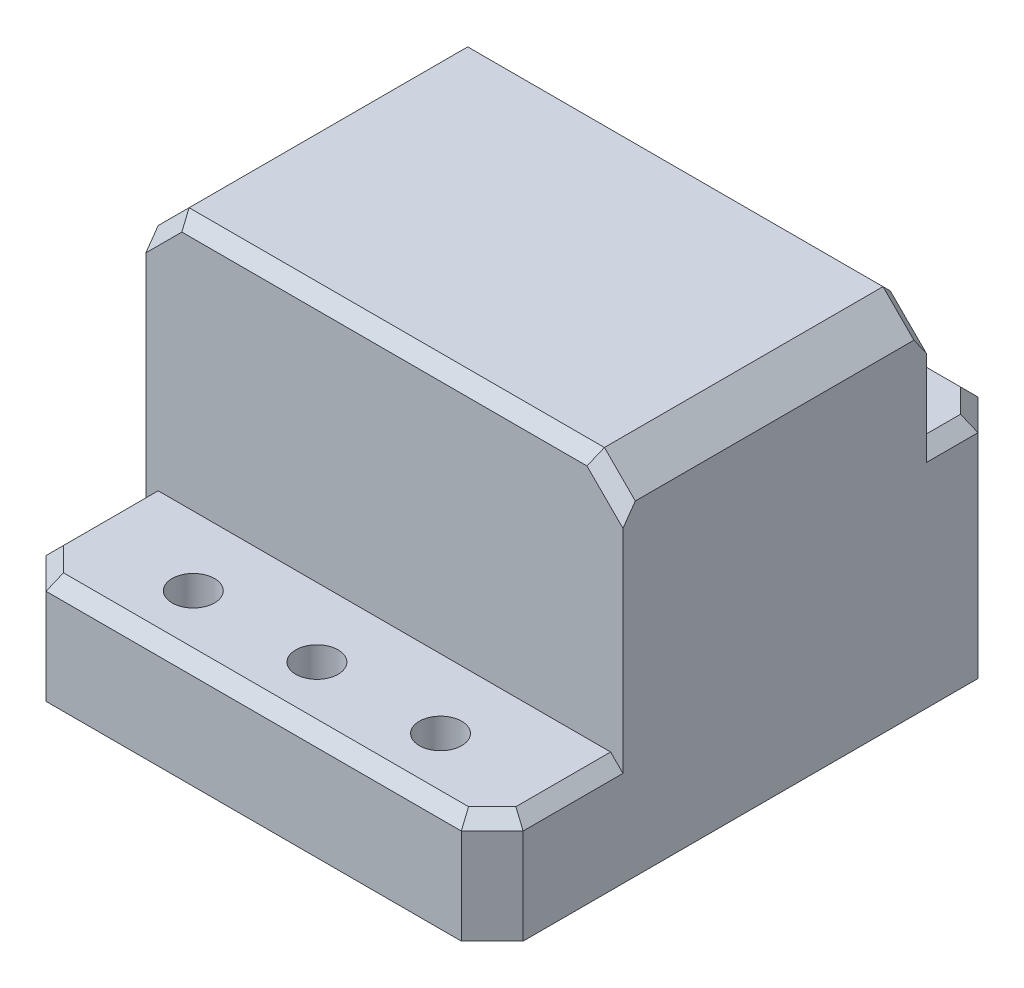
ISO-10303-21;
HEADER;
FILE_DESCRIPTION(('STEP AP214'),'2;1');
FILE_NAME('part.step','',(''),(''),'','','');
FILE_SCHEMA(('AUTOMOTIVE_DESIGN { 1 0 10303 214 1 1 1 1 }'));
ENDSEC;
DATA;
#1=APPLICATION_CONTEXT('core data for automotive mechanical design processes');
#2=APPLICATION_PROTOCOL_DEFINITION('international standard','automotive_design',2000,#1);
#3=PRODUCT_CONTEXT('',#1,'mechanical');
#4=PRODUCT('Part','Part','',(#3));
#5=PRODUCT_RELATED_PRODUCT_CATEGORY('part','',(#4));
#6=PRODUCT_DEFINITION_FORMATION('','',#4);
#7=PRODUCT_DEFINITION_CONTEXT('part definition',#1,'design');
#8=PRODUCT_DEFINITION('design','',#6,#7);
#9=PRODUCT_DEFINITION_SHAPE('','',#8);
#10=(LENGTH_UNIT() NAMED_UNIT(*) SI_UNIT(.MILLI.,.METRE.));
#11=(NAMED_UNIT(*) PLANE_ANGLE_UNIT() SI_UNIT($,.RADIAN.));
#12=(NAMED_UNIT(*) SI_UNIT($,.STERADIAN.) SOLID_ANGLE_UNIT());
#13=UNCERTAINTY_MEASURE_WITH_UNIT(LENGTH_MEASURE(1.E-05),#10,'distance_accuracy_value','');
#14=(GEOMETRIC_REPRESENTATION_CONTEXT(3) GLOBAL_UNCERTAINTY_ASSIGNED_CONTEXT((#13)) GLOBAL_UNIT_ASSIGNED_CONTEXT((#10,
#11,#12)) REPRESENTATION_CONTEXT('',''));
#15=CARTESIAN_POINT('',(0.,0.,0.));
#16=DIRECTION('',(0.,0.,1.));
#17=DIRECTION('',(1.,0.,0.));
#18=AXIS2_PLACEMENT_3D('',#15,#16,#17);
#19=CARTESIAN_POINT('',(49.022,-3.38503846153846,25.2534615384615));
#20=DIRECTION('',(0.,-1.,0.));
#21=DIRECTION('',(0.,0.,-1.));
#22=AXIS2_PLACEMENT_3D('',#19,#20,#21);
#23=PLANE('',#22);
#24=CARTESIAN_POINT('',(37.3653132700061,-3.38503846153846,18.9080971700832));
#25=DIRECTION('',(0.,1.,0.));
#26=DIRECTION('',(0.,0.,1.));
#27=AXIS2_PLACEMENT_3D('',#24,#25,#26);
#28=CIRCLE('',#27,2.17841054390278);
#29=CARTESIAN_POINT('',(37.3653132700061,-3.38503846153846,21.086507713986));
#30=VERTEX_POINT('',#29);
#31=EDGE_CURVE('E906',#30,#30,#28,.T.);
#32=ORIENTED_EDGE('',*,*,#31,.F.);
#33=EDGE_LOOP('',(#32));
#34=FACE_BOUND('',#33,.T.);
#35=CARTESIAN_POINT('',(24.6653132700061,-3.38503846153846,18.9080971700832));
#36=DIRECTION('',(0.,1.,0.));
#37=DIRECTION('',(0.,0.,1.));
#38=AXIS2_PLACEMENT_3D('',#35,#36,#37);
#39=CIRCLE('',#38,2.17841054390278);
#40=CARTESIAN_POINT('',(24.6653132700061,-3.38503846153846,21.086507713986));
#41=VERTEX_POINT('',#40);
#42=EDGE_CURVE('E901',#41,#41,#39,.T.);
#43=ORIENTED_EDGE('',*,*,#42,.F.);
#44=EDGE_LOOP('',(#43));
#45=FACE_BOUND('',#44,.T.);
#46=CARTESIAN_POINT('',(11.9653132700061,-3.38503846153846,18.9080971700833));
#47=DIRECTION('',(0.,1.,0.));
#48=DIRECTION('',(0.,0.,1.));
#49=AXIS2_PLACEMENT_3D('',#46,#47,#48);
#50=CIRCLE('',#49,2.17841054390278);
#51=CARTESIAN_POINT('',(11.9653132700061,-3.38503846153846,21.0865077139861));
#52=VERTEX_POINT('',#51);
#53=EDGE_CURVE('E897',#52,#52,#50,.T.);
#54=ORIENTED_EDGE('',*,*,#53,.F.);
#55=EDGE_LOOP('',(#54));
#56=FACE_BOUND('',#55,.T.);
#57=DIRECTION('',(0.70710678118655,0.,-0.707106781186545));
#58=VECTOR('',#57,1.);
#59=CARTESIAN_POINT('',(48.1239743878931,-3.38503846153846,21.1804359263546));
#60=LINE('',#59,#58);
#61=CARTESIAN_POINT('',(45.3209487757862,-3.38503846153846,23.9834615384615));
#62=VERTEX_POINT('',#61);
#63=CARTESIAN_POINT('',(47.752,-3.38503846153846,21.5524103142477));
#64=VERTEX_POINT('',#63);
#65=EDGE_CURVE('E333',#62,#64,#60,.T.);
#66=ORIENTED_EDGE('',*,*,#65,.T.);
#67=DIRECTION('',(0.,0.,-1.));
#68=VECTOR('',#67,1.);
#69=CARTESIAN_POINT('',(47.752,-3.38503846153846,25.2534615384615));
#70=LINE('',#69,#68);
#71=CARTESIAN_POINT('',(47.752,-3.38503846153846,11.8207692307692));
#72=VERTEX_POINT('',#71);
#73=EDGE_CURVE('E335',#64,#72,#70,.T.);
#74=ORIENTED_EDGE('',*,*,#73,.T.);
#75=DIRECTION('',(-1.,0.,0.));
#76=VECTOR('',#75,1.);
#77=CARTESIAN_POINT('',(49.022,-3.38503846153846,11.8207692307692));
#78=LINE('',#77,#76);
#79=CARTESIAN_POINT('',(1.26999999999999,-3.38503846153846,11.8207692307692));
#80=VERTEX_POINT('',#79);
#81=EDGE_CURVE('E241',#72,#80,#78,.T.);
#82=ORIENTED_EDGE('',*,*,#81,.T.);
#83=DIRECTION('',(0.,0.,1.));
#84=VECTOR('',#83,1.);
#85=CARTESIAN_POINT('',(1.26999999999999,-3.38503846153846,22.0784615384615));
#86=LINE('',#85,#84);
#87=CARTESIAN_POINT('',(1.26999999999999,-3.38503846153846,21.5524103142477));
#88=VERTEX_POINT('',#87);
#89=EDGE_CURVE('E327',#80,#88,#86,.T.);
#90=ORIENTED_EDGE('',*,*,#89,.T.);
#91=DIRECTION('',(0.707106781186547,0.,0.707106781186548));
#92=VECTOR('',#91,1.);
#93=CARTESIAN_POINT('',(4.0730256121069,-3.38503846153846,24.3554359263546));
#94=LINE('',#93,#92);
#95=CARTESIAN_POINT('',(3.70105122421381,-3.38503846153846,23.9834615384615));
#96=VERTEX_POINT('',#95);
#97=EDGE_CURVE('E329',#88,#96,#94,.T.);
#98=ORIENTED_EDGE('',*,*,#97,.T.);
#99=DIRECTION('',(1.,0.,0.));
#100=VECTOR('',#99,1.);
#101=CARTESIAN_POINT('',(49.022,-3.38503846153846,23.9834615384615));
#102=LINE('',#101,#100);
#103=EDGE_CURVE('E331',#96,#62,#102,.T.);
#104=ORIENTED_EDGE('',*,*,#103,.T.);
#105=EDGE_LOOP('',(#66,#74,#82,#90,#98,#104));
#106=FACE_BOUND('',#105,.T.);
#107=ADVANCED_FACE('F36',(#34,#45,#56,#106),#23,.F.);
#108=CARTESIAN_POINT('',(49.022,-3.38503846153846,25.2534615384615));
#109=DIRECTION('',(0.,0.,-1.));
#110=DIRECTION('',(-1.,0.,0.));
#111=AXIS2_PLACEMENT_3D('',#108,#109,#110);
#112=PLANE('',#111);
#113=DIRECTION('',(0.,1.,0.));
#114=VECTOR('',#113,1.);
#115=CARTESIAN_POINT('',(45.847,-3.38503846153846,25.2534615384615));
#116=LINE('',#115,#114);
#117=CARTESIAN_POINT('',(45.847,-14.4535769230769,25.2534615384615));
#118=VERTEX_POINT('',#117);
#119=CARTESIAN_POINT('',(45.847,-4.65503846153846,25.2534615384615));
#120=VERTEX_POINT('',#119);
#121=EDGE_CURVE('E219',#118,#120,#116,.T.);
#122=ORIENTED_EDGE('',*,*,#121,.T.);
#123=DIRECTION('',(-1.,0.,0.));
#124=VECTOR('',#123,1.);
#125=CARTESIAN_POINT('',(49.022,-4.65503846153846,25.2534615384615));
#126=LINE('',#125,#124);
#127=CARTESIAN_POINT('',(3.175,-4.65503846153845,25.2534615384615));
#128=VERTEX_POINT('',#127);
#129=EDGE_CURVE('E339',#120,#128,#126,.T.);
#130=ORIENTED_EDGE('',*,*,#129,.T.);
#131=DIRECTION('',(0.,-1.,0.));
#132=VECTOR('',#131,1.);
#133=CARTESIAN_POINT('',(3.175,-14.4535769230769,25.2534615384615));
#134=LINE('',#133,#132);
#135=CARTESIAN_POINT('',(3.175,-14.4535769230769,25.2534615384615));
#136=VERTEX_POINT('',#135);
#137=EDGE_CURVE('E279',#128,#136,#134,.T.);
#138=ORIENTED_EDGE('',*,*,#137,.T.);
#139=DIRECTION('',(-1.,0.,0.));
#140=VECTOR('',#139,1.);
#141=CARTESIAN_POINT('',(49.022,-14.4535769230769,25.2534615384615));
#142=LINE('',#141,#140);
#143=EDGE_CURVE('E256',#118,#136,#142,.T.);
#144=ORIENTED_EDGE('',*,*,#143,.F.);
#145=EDGE_LOOP('',(#122,#130,#138,#144));
#146=FACE_BOUND('',#145,.T.);
#147=ADVANCED_FACE('F431',(#146),#112,.F.);
#148=CARTESIAN_POINT('',(49.022,-14.4535769230769,25.2534615384615));
#149=DIRECTION('',(0.,1.,0.));
#150=DIRECTION('',(0.,0.,1.));
#151=AXIS2_PLACEMENT_3D('',#148,#149,#150);
#152=PLANE('',#151);
#153=DIRECTION('',(-1.,0.,0.));
#154=VECTOR('',#153,1.);
#155=CARTESIAN_POINT('',(49.022,-14.4535769230769,-27.8325384615385));
#156=LINE('',#155,#154);
#157=CARTESIAN_POINT('',(45.847,-14.4535769230769,-27.8325384615385));
#158=VERTEX_POINT('',#157);
#159=CARTESIAN_POINT('',(3.175,-14.4535769230769,-27.8325384615385));
#160=VERTEX_POINT('',#159);
#161=EDGE_CURVE('E253',#158,#160,#156,.T.);
#162=ORIENTED_EDGE('',*,*,#161,.F.);
#163=DIRECTION('',(-0.70710678118655,0.,-0.707106781186545));
#164=VECTOR('',#163,1.);
#165=CARTESIAN_POINT('',(49.022,-14.4535769230769,-24.6575384615385));
#166=LINE('',#165,#164);
#167=CARTESIAN_POINT('',(49.022,-14.4535769230769,-24.6575384615385));
#168=VERTEX_POINT('',#167);
#169=EDGE_CURVE('E223',#158,#168,#166,.F.);
#170=ORIENTED_EDGE('',*,*,#169,.T.);
#171=DIRECTION('',(0.,0.,-1.));
#172=VECTOR('',#171,1.);
#173=CARTESIAN_POINT('',(49.022,-14.4535769230769,25.2534615384615));
#174=LINE('',#173,#172);
#175=CARTESIAN_POINT('',(49.022,-14.4535769230769,22.0784615384615));
#176=VERTEX_POINT('',#175);
#177=EDGE_CURVE('E207',#176,#168,#174,.T.);
#178=ORIENTED_EDGE('',*,*,#177,.F.);
#179=DIRECTION('',(0.70710678118655,0.,-0.707106781186545));
#180=VECTOR('',#179,1.);
#181=CARTESIAN_POINT('',(49.022,-14.4535769230769,22.0784615384615));
#182=LINE('',#181,#180);
#183=EDGE_CURVE('E216',#176,#118,#182,.F.);
#184=ORIENTED_EDGE('',*,*,#183,.T.);
#185=ORIENTED_EDGE('',*,*,#143,.T.);
#186=DIRECTION('',(-0.707106781186547,0.,-0.707106781186548));
#187=VECTOR('',#186,1.);
#188=CARTESIAN_POINT('',(3.175,-14.4535769230769,25.2534615384615));
#189=LINE('',#188,#187);
#190=CARTESIAN_POINT('',(0.,-14.4535769230769,22.0784615384615));
#191=VERTEX_POINT('',#190);
#192=EDGE_CURVE('E224',#136,#191,#189,.T.);
#193=ORIENTED_EDGE('',*,*,#192,.T.);
#194=DIRECTION('',(0.,0.,-1.));
#195=VECTOR('',#194,1.);
#196=CARTESIAN_POINT('',(0.,-14.4535769230769,25.2534615384615));
#197=LINE('',#196,#195);
#198=CARTESIAN_POINT('',(0.,-14.4535769230769,-24.6575384615385));
#199=VERTEX_POINT('',#198);
#200=EDGE_CURVE('E242',#191,#199,#197,.T.);
#201=ORIENTED_EDGE('',*,*,#200,.T.);
#202=DIRECTION('',(0.707106781186547,0.,-0.707106781186548));
#203=VECTOR('',#202,1.);
#204=CARTESIAN_POINT('',(3.175,-14.4535769230769,-27.8325384615385));
#205=LINE('',#204,#203);
#206=EDGE_CURVE('E275',#199,#160,#205,.T.);
#207=ORIENTED_EDGE('',*,*,#206,.T.);
#208=EDGE_LOOP('',(#162,#170,#178,#184,#185,#193,#201,#207));
#209=FACE_BOUND('',#208,.T.);
#210=ADVANCED_FACE('F227',(#209),#152,.F.);
#211=CARTESIAN_POINT('',(49.022,8.68973076923077,-27.8325384615385));
#212=DIRECTION('',(0.,0.,1.));
#213=DIRECTION('',(0.,-1.,0.));
#214=AXIS2_PLACEMENT_3D('',#211,#212,#213);
#215=PLANE('',#214);
#216=DIRECTION('',(0.,1.,0.));
#217=VECTOR('',#216,1.);
#218=CARTESIAN_POINT('',(3.175,8.68973076923077,-27.8325384615385));
#219=LINE('',#218,#217);
#220=CARTESIAN_POINT('',(3.175,7.41973076923076,-27.8325384615385));
#221=VERTEX_POINT('',#220);
#222=EDGE_CURVE('E270',#160,#221,#219,.T.);
#223=ORIENTED_EDGE('',*,*,#222,.T.);
#224=DIRECTION('',(1.,0.,0.));
#225=VECTOR('',#224,1.);
#226=CARTESIAN_POINT('',(49.022,7.41973076923076,-27.8325384615385));
#227=LINE('',#226,#225);
#228=CARTESIAN_POINT('',(45.847,7.41973076923076,-27.8325384615385));
#229=VERTEX_POINT('',#228);
#230=EDGE_CURVE('E302',#221,#229,#227,.T.);
#231=ORIENTED_EDGE('',*,*,#230,.T.);
#232=DIRECTION('',(0.,-1.,0.));
#233=VECTOR('',#232,1.);
#234=CARTESIAN_POINT('',(45.847,8.68973076923077,-27.8325384615385));
#235=LINE('',#234,#233);
#236=EDGE_CURVE('E273',#229,#158,#235,.T.);
#237=ORIENTED_EDGE('',*,*,#236,.T.);
#238=ORIENTED_EDGE('',*,*,#161,.T.);
#239=EDGE_LOOP('',(#223,#231,#237,#238));
#240=FACE_BOUND('',#239,.T.);
#241=ADVANCED_FACE('F468',(#240),#215,.F.);
#242=CARTESIAN_POINT('',(49.022,8.68973076923077,-19.3430769230769));
#243=DIRECTION('',(0.,-1.,0.));
#244=DIRECTION('',(0.,0.,-1.));
#245=AXIS2_PLACEMENT_3D('',#242,#243,#244);
#246=PLANE('',#245);
#247=DIRECTION('',(-1.,0.,0.));
#248=VECTOR('',#247,1.);
#249=CARTESIAN_POINT('',(49.022,8.68973076923077,-19.3430769230769));
#250=LINE('',#249,#248);
#251=CARTESIAN_POINT('',(47.752,8.68973076923077,-19.3430769230769));
#252=VERTEX_POINT('',#251);
#253=CARTESIAN_POINT('',(1.27,8.68973076923077,-19.3430769230769));
#254=VERTEX_POINT('',#253);
#255=EDGE_CURVE('E250',#252,#254,#250,.T.);
#256=ORIENTED_EDGE('',*,*,#255,.F.);
#257=DIRECTION('',(0.,0.,-1.));
#258=VECTOR('',#257,1.);
#259=CARTESIAN_POINT('',(47.752,8.68973076923077,-19.3430769230769));
#260=LINE('',#259,#258);
#261=CARTESIAN_POINT('',(47.752,8.68973076923077,-24.1314872373246));
#262=VERTEX_POINT('',#261);
#263=EDGE_CURVE('E298',#252,#262,#260,.T.);
#264=ORIENTED_EDGE('',*,*,#263,.T.);
#265=DIRECTION('',(-0.70710678118655,0.,-0.707106781186545));
#266=VECTOR('',#265,1.);
#267=CARTESIAN_POINT('',(44.9489743878931,8.68973076923077,-26.9345128494315));
#268=LINE('',#267,#266);
#269=CARTESIAN_POINT('',(45.3209487757861,8.68973076923077,-26.5625384615385));
#270=VERTEX_POINT('',#269);
#271=EDGE_CURVE('E296',#262,#270,#268,.T.);
#272=ORIENTED_EDGE('',*,*,#271,.T.);
#273=DIRECTION('',(-1.,0.,0.));
#274=VECTOR('',#273,1.);
#275=CARTESIAN_POINT('',(49.022,8.68973076923077,-26.5625384615385));
#276=LINE('',#275,#274);
#277=CARTESIAN_POINT('',(3.70105122421385,8.68973076923077,-26.5625384615385));
#278=VERTEX_POINT('',#277);
#279=EDGE_CURVE('E294',#270,#278,#276,.T.);
#280=ORIENTED_EDGE('',*,*,#279,.T.);
#281=DIRECTION('',(-0.707106781186547,0.,0.707106781186548));
#282=VECTOR('',#281,1.);
#283=CARTESIAN_POINT('',(0.898025612106923,8.68973076923077,-23.7595128494315));
#284=LINE('',#283,#282);
#285=CARTESIAN_POINT('',(1.27,8.68973076923077,-24.1314872373246));
#286=VERTEX_POINT('',#285);
#287=EDGE_CURVE('E292',#278,#286,#284,.T.);
#288=ORIENTED_EDGE('',*,*,#287,.T.);
#289=DIRECTION('',(0.,0.,1.));
#290=VECTOR('',#289,1.);
#291=CARTESIAN_POINT('',(1.27,8.68973076923077,-19.3430769230769));
#292=LINE('',#291,#290);
#293=EDGE_CURVE('E290',#286,#254,#292,.T.);
#294=ORIENTED_EDGE('',*,*,#293,.T.);
#295=EDGE_LOOP('',(#256,#264,#272,#280,#288,#294));
#296=FACE_BOUND('',#295,.T.);
#297=ADVANCED_FACE('F484',(#296),#246,.F.);
#298=CARTESIAN_POINT('',(49.022,22.1224230769231,-19.3430769230769));
#299=DIRECTION('',(0.,0.,1.));
#300=DIRECTION('',(0.,-1.,0.));
#301=AXIS2_PLACEMENT_3D('',#298,#299,#300);
#302=PLANE('',#301);
#303=DIRECTION('',(0.,1.,0.));
#304=VECTOR('',#303,1.);
#305=CARTESIAN_POINT('',(0.,22.1224230769231,-19.3430769230769));
#306=LINE('',#305,#304);
#307=CARTESIAN_POINT('',(0.,7.41973076923076,-19.3430769230769));
#308=VERTEX_POINT('',#307);
#309=CARTESIAN_POINT('',(0.,17.1513718527093,-19.3430769230769));
#310=VERTEX_POINT('',#309);
#311=EDGE_CURVE('E234',#308,#310,#306,.T.);
#312=ORIENTED_EDGE('',*,*,#311,.T.);
#313=DIRECTION('',(0.70710678118655,0.707106781186545,0.));
#314=VECTOR('',#313,1.);
#315=CARTESIAN_POINT('',(4.07302561210692,21.2243974648162,-19.3430769230769));
#316=LINE('',#315,#314);
#317=CARTESIAN_POINT('',(3.70105122421384,20.8524230769231,-19.3430769230769));
#318=VERTEX_POINT('',#317);
#319=EDGE_CURVE('E366',#310,#318,#316,.T.);
#320=ORIENTED_EDGE('',*,*,#319,.T.);
#321=DIRECTION('',(1.,0.,0.));
#322=VECTOR('',#321,1.);
#323=CARTESIAN_POINT('',(49.022,20.8524230769231,-19.3430769230769));
#324=LINE('',#323,#322);
#325=CARTESIAN_POINT('',(45.3209487757861,20.8524230769231,-19.3430769230769));
#326=VERTEX_POINT('',#325);
#327=EDGE_CURVE('E364',#318,#326,#324,.T.);
#328=ORIENTED_EDGE('',*,*,#327,.T.);
#329=DIRECTION('',(0.70710678118655,-0.707106781186545,0.));
#330=VECTOR('',#329,1.);
#331=CARTESIAN_POINT('',(48.1239743878931,18.0493974648162,-19.3430769230769));
#332=LINE('',#331,#330);
#333=CARTESIAN_POINT('',(49.022,17.1513718527093,-19.3430769230769));
#334=VERTEX_POINT('',#333);
#335=EDGE_CURVE('E351',#326,#334,#332,.T.);
#336=ORIENTED_EDGE('',*,*,#335,.T.);
#337=DIRECTION('',(0.,1.,0.));
#338=VECTOR('',#337,1.);
#339=CARTESIAN_POINT('',(49.022,22.1224230769231,-19.3430769230769));
#340=LINE('',#339,#338);
#341=CARTESIAN_POINT('',(49.022,7.41973076923076,-19.3430769230769));
#342=VERTEX_POINT('',#341);
#343=EDGE_CURVE('E229',#342,#334,#340,.T.);
#344=ORIENTED_EDGE('',*,*,#343,.F.);
#345=DIRECTION('',(0.707106781186546,-0.70710678118655,0.));
#346=VECTOR('',#345,1.);
#347=CARTESIAN_POINT('',(41.6706538461538,14.771076923077,-19.3430769230769));
#348=LINE('',#347,#346);
#349=EDGE_CURVE('E308',#342,#252,#348,.F.);
#350=ORIENTED_EDGE('',*,*,#349,.T.);
#351=ORIENTED_EDGE('',*,*,#255,.T.);
#352=DIRECTION('',(-0.707106781186546,-0.70710678118655,0.));
#353=VECTOR('',#352,1.);
#354=CARTESIAN_POINT('',(31.862346153846,39.282076923077,-19.3430769230769));
#355=LINE('',#354,#353);
#356=EDGE_CURVE('E310',#254,#308,#355,.T.);
#357=ORIENTED_EDGE('',*,*,#356,.T.);
#358=EDGE_LOOP('',(#312,#320,#328,#336,#344,#350,#351,#357));
#359=FACE_BOUND('',#358,.T.);
#360=ADVANCED_FACE('F482',(#359),#302,.F.);
#361=CARTESIAN_POINT('',(49.022,22.1224230769231,11.8207692307692));
#362=DIRECTION('',(0.,-1.,0.));
#363=DIRECTION('',(0.,0.,-1.));
#364=AXIS2_PLACEMENT_3D('',#361,#362,#363);
#365=PLANE('',#364);
#366=DIRECTION('',(0.,0.,-1.));
#367=VECTOR('',#366,1.);
#368=CARTESIAN_POINT('',(45.847,22.1224230769231,11.8207692307692));
#369=LINE('',#368,#367);
#370=CARTESIAN_POINT('',(45.847,22.1224230769231,10.5507692307692));
#371=VERTEX_POINT('',#370);
#372=CARTESIAN_POINT('',(45.847,22.1224230769231,-18.0730769230769));
#373=VERTEX_POINT('',#372);
#374=EDGE_CURVE('E213',#371,#373,#369,.T.);
#375=ORIENTED_EDGE('',*,*,#374,.T.);
#376=DIRECTION('',(-1.,0.,0.));
#377=VECTOR('',#376,1.);
#378=CARTESIAN_POINT('',(49.022,22.1224230769231,-18.0730769230769));
#379=LINE('',#378,#377);
#380=CARTESIAN_POINT('',(3.17500000000002,22.1224230769231,-18.0730769230769));
#381=VERTEX_POINT('',#380);
#382=EDGE_CURVE('E379',#373,#381,#379,.T.);
#383=ORIENTED_EDGE('',*,*,#382,.T.);
#384=DIRECTION('',(0.,0.,1.));
#385=VECTOR('',#384,1.);
#386=CARTESIAN_POINT('',(3.17500000000002,22.1224230769231,11.8207692307692));
#387=LINE('',#386,#385);
#388=CARTESIAN_POINT('',(3.17500000000002,22.1224230769231,10.5507692307693));
#389=VERTEX_POINT('',#388);
#390=EDGE_CURVE('E258',#381,#389,#387,.T.);
#391=ORIENTED_EDGE('',*,*,#390,.T.);
#392=DIRECTION('',(1.,0.,0.));
#393=VECTOR('',#392,1.);
#394=CARTESIAN_POINT('',(49.022,22.1224230769231,10.5507692307692));
#395=LINE('',#394,#393);
#396=EDGE_CURVE('E377',#389,#371,#395,.T.);
#397=ORIENTED_EDGE('',*,*,#396,.T.);
#398=EDGE_LOOP('',(#375,#383,#391,#397));
#399=FACE_BOUND('',#398,.T.);
#400=ADVANCED_FACE('F491',(#399),#365,.F.);
#401=CARTESIAN_POINT('',(49.022,22.1224230769231,11.8207692307692));
#402=DIRECTION('',(0.,0.,-1.));
#403=DIRECTION('',(0.,1.,0.));
#404=AXIS2_PLACEMENT_3D('',#401,#402,#403);
#405=PLANE('',#404);
#406=DIRECTION('',(0.,-1.,0.));
#407=VECTOR('',#406,1.);
#408=CARTESIAN_POINT('',(49.022,22.1224230769231,11.8207692307692));
#409=LINE('',#408,#407);
#410=CARTESIAN_POINT('',(49.022,17.1513718527093,11.8207692307692));
#411=VERTEX_POINT('',#410);
#412=CARTESIAN_POINT('',(49.022,-4.65503846153846,11.8207692307692));
#413=VERTEX_POINT('',#412);
#414=EDGE_CURVE('E232',#411,#413,#409,.T.);
#415=ORIENTED_EDGE('',*,*,#414,.F.);
#416=DIRECTION('',(-0.70710678118655,0.707106781186545,0.));
#417=VECTOR('',#416,1.);
#418=CARTESIAN_POINT('',(44.9489743878931,21.2243974648162,11.8207692307692));
#419=LINE('',#418,#417);
#420=CARTESIAN_POINT('',(45.3209487757861,20.8524230769231,11.8207692307692));
#421=VERTEX_POINT('',#420);
#422=EDGE_CURVE('E11',#411,#421,#419,.T.);
#423=ORIENTED_EDGE('',*,*,#422,.T.);
#424=DIRECTION('',(-1.,0.,0.));
#425=VECTOR('',#424,1.);
#426=CARTESIAN_POINT('',(49.022,20.8524230769231,11.8207692307692));
#427=LINE('',#426,#425);
#428=CARTESIAN_POINT('',(3.70105122421383,20.8524230769231,11.8207692307692));
#429=VERTEX_POINT('',#428);
#430=EDGE_CURVE('E46',#421,#429,#427,.T.);
#431=ORIENTED_EDGE('',*,*,#430,.T.);
#432=DIRECTION('',(-0.70710678118655,-0.707106781186545,0.));
#433=VECTOR('',#432,1.);
#434=CARTESIAN_POINT('',(0.898025612106898,18.0493974648162,11.8207692307692));
#435=LINE('',#434,#433);
#436=CARTESIAN_POINT('',(0.,17.1513718527093,11.8207692307692));
#437=VERTEX_POINT('',#436);
#438=EDGE_CURVE('E389',#429,#437,#435,.T.);
#439=ORIENTED_EDGE('',*,*,#438,.T.);
#440=DIRECTION('',(0.,-1.,0.));
#441=VECTOR('',#440,1.);
#442=CARTESIAN_POINT('',(0.,22.1224230769231,11.8207692307692));
#443=LINE('',#442,#441);
#444=CARTESIAN_POINT('',(0.,-4.65503846153846,11.8207692307692));
#445=VERTEX_POINT('',#444);
#446=EDGE_CURVE('E230',#437,#445,#443,.T.);
#447=ORIENTED_EDGE('',*,*,#446,.T.);
#448=DIRECTION('',(0.707106781186546,0.707106781186549,0.));
#449=VECTOR('',#448,1.);
#450=CARTESIAN_POINT('',(37.8997307692306,33.2446923076924,11.8207692307692));
#451=LINE('',#450,#449);
#452=EDGE_CURVE('E349',#445,#80,#451,.T.);
#453=ORIENTED_EDGE('',*,*,#452,.T.);
#454=ORIENTED_EDGE('',*,*,#81,.F.);
#455=DIRECTION('',(-0.707106781186546,0.707106781186549,0.));
#456=VECTOR('',#455,1.);
#457=CARTESIAN_POINT('',(35.6332692307692,8.73369230769238,11.8207692307692));
#458=LINE('',#457,#456);
#459=EDGE_CURVE('E346',#72,#413,#458,.F.);
#460=ORIENTED_EDGE('',*,*,#459,.T.);
#461=EDGE_LOOP('',(#415,#423,#431,#439,#447,#453,#454,#460));
#462=FACE_BOUND('',#461,.T.);
#463=ADVANCED_FACE('F405',(#462),#405,.F.);
#464=CARTESIAN_POINT('',(49.022,0.,0.));
#465=DIRECTION('',(-1.,0.,0.));
#466=DIRECTION('',(0.,0.,1.));
#467=AXIS2_PLACEMENT_3D('',#464,#465,#466);
#468=PLANE('',#467);
#469=ORIENTED_EDGE('',*,*,#343,.T.);
#470=DIRECTION('',(0.,-0.816496580927726,-0.577350269189626));
#471=VECTOR('',#470,1.);
#472=CARTESIAN_POINT('',(49.022,18.8083889274472,-18.1713889129878));
#473=LINE('',#472,#471);
#474=CARTESIAN_POINT('',(49.022,18.9474230769231,-18.0730769230769));
#475=VERTEX_POINT('',#474);
#476=EDGE_CURVE('E383',#334,#475,#473,.F.);
#477=ORIENTED_EDGE('',*,*,#476,.T.);
#478=DIRECTION('',(0.,0.,1.));
#479=VECTOR('',#478,1.);
#480=CARTESIAN_POINT('',(49.022,18.9474230769231,0.));
#481=LINE('',#480,#479);
#482=CARTESIAN_POINT('',(49.022,18.9474230769231,10.5507692307692));
#483=VERTEX_POINT('',#482);
#484=EDGE_CURVE('E264',#475,#483,#481,.T.);
#485=ORIENTED_EDGE('',*,*,#484,.T.);
#486=DIRECTION('',(0.,0.816496580927726,-0.577350269189627));
#487=VECTOR('',#486,1.);
#488=CARTESIAN_POINT('',(49.022,18.8083889274472,10.6490812206802));
#489=LINE('',#488,#487);
#490=EDGE_CURVE('E381',#483,#411,#489,.F.);
#491=ORIENTED_EDGE('',*,*,#490,.T.);
#492=ORIENTED_EDGE('',*,*,#414,.T.);
#493=DIRECTION('',(0.,0.,1.));
#494=VECTOR('',#493,1.);
#495=CARTESIAN_POINT('',(49.022,-4.65503846153846,0.));
#496=LINE('',#495,#494);
#497=CARTESIAN_POINT('',(49.022,-4.65503846153846,22.0784615384615));
#498=VERTEX_POINT('',#497);
#499=EDGE_CURVE('E210',#413,#498,#496,.T.);
#500=ORIENTED_EDGE('',*,*,#499,.T.);
#501=DIRECTION('',(0.,-1.,0.));
#502=VECTOR('',#501,1.);
#503=CARTESIAN_POINT('',(49.022,0.,22.0784615384615));
#504=LINE('',#503,#502);
#505=EDGE_CURVE('E201',#498,#176,#504,.T.);
#506=ORIENTED_EDGE('',*,*,#505,.T.);
#507=ORIENTED_EDGE('',*,*,#177,.T.);
#508=DIRECTION('',(0.,1.,0.));
#509=VECTOR('',#508,1.);
#510=CARTESIAN_POINT('',(49.022,0.,-24.6575384615385));
#511=LINE('',#510,#509);
#512=CARTESIAN_POINT('',(49.022,7.41973076923076,-24.6575384615385));
#513=VERTEX_POINT('',#512);
#514=EDGE_CURVE('E212',#168,#513,#511,.T.);
#515=ORIENTED_EDGE('',*,*,#514,.T.);
#516=DIRECTION('',(0.,0.,1.));
#517=VECTOR('',#516,1.);
#518=CARTESIAN_POINT('',(49.022,7.41973076923076,0.));
#519=LINE('',#518,#517);
#520=EDGE_CURVE('E287',#513,#342,#519,.T.);
#521=ORIENTED_EDGE('',*,*,#520,.T.);
#522=EDGE_LOOP('',(#469,#477,#485,#491,#492,#500,#506,#507,#515,#521));
#523=FACE_BOUND('',#522,.T.);
#524=ADVANCED_FACE('F204',(#523),#468,.F.);
#525=CARTESIAN_POINT('',(0.,0.,0.));
#526=DIRECTION('',(-1.,0.,0.));
#527=DIRECTION('',(0.,0.,1.));
#528=AXIS2_PLACEMENT_3D('',#525,#526,#527);
#529=PLANE('',#528);
#530=DIRECTION('',(0.,0.,-1.));
#531=VECTOR('',#530,1.);
#532=CARTESIAN_POINT('',(0.,18.9474230769231,-19.3430769230769));
#533=LINE('',#532,#531);
#534=CARTESIAN_POINT('',(0.,18.9474230769231,10.5507692307693));
#535=VERTEX_POINT('',#534);
#536=CARTESIAN_POINT('',(0.,18.9474230769231,-18.0730769230769));
#537=VERTEX_POINT('',#536);
#538=EDGE_CURVE('E261',#535,#537,#533,.T.);
#539=ORIENTED_EDGE('',*,*,#538,.T.);
#540=DIRECTION('',(0.,-0.816496580927725,-0.577350269189628));
#541=VECTOR('',#540,1.);
#542=CARTESIAN_POINT('',(0.,14.8355378584503,-20.9806188445198));
#543=LINE('',#542,#541);
#544=EDGE_CURVE('E375',#537,#310,#543,.T.);
#545=ORIENTED_EDGE('',*,*,#544,.T.);
#546=ORIENTED_EDGE('',*,*,#311,.F.);
#547=DIRECTION('',(0.,0.,-1.));
#548=VECTOR('',#547,1.);
#549=CARTESIAN_POINT('',(0.,7.41973076923076,-24.6575384615384));
#550=LINE('',#549,#548);
#551=CARTESIAN_POINT('',(0.,7.41973076923076,-24.6575384615384));
#552=VERTEX_POINT('',#551);
#553=EDGE_CURVE('E306',#308,#552,#550,.T.);
#554=ORIENTED_EDGE('',*,*,#553,.T.);
#555=DIRECTION('',(0.,-1.,0.));
#556=VECTOR('',#555,1.);
#557=CARTESIAN_POINT('',(0.,-14.4535769230769,-24.6575384615385));
#558=LINE('',#557,#556);
#559=EDGE_CURVE('E282',#552,#199,#558,.T.);
#560=ORIENTED_EDGE('',*,*,#559,.T.);
#561=ORIENTED_EDGE('',*,*,#200,.F.);
#562=DIRECTION('',(0.,1.,0.));
#563=VECTOR('',#562,1.);
#564=CARTESIAN_POINT('',(0.,-3.38503846153846,22.0784615384615));
#565=LINE('',#564,#563);
#566=CARTESIAN_POINT('',(0.,-4.65503846153846,22.0784615384615));
#567=VERTEX_POINT('',#566);
#568=EDGE_CURVE('E284',#191,#567,#565,.T.);
#569=ORIENTED_EDGE('',*,*,#568,.T.);
#570=DIRECTION('',(0.,0.,-1.));
#571=VECTOR('',#570,1.);
#572=CARTESIAN_POINT('',(0.,-4.65503846153846,11.8207692307692));
#573=LINE('',#572,#571);
#574=EDGE_CURVE('E343',#567,#445,#573,.T.);
#575=ORIENTED_EDGE('',*,*,#574,.T.);
#576=ORIENTED_EDGE('',*,*,#446,.F.);
#577=DIRECTION('',(0.,0.816496580927725,-0.577350269189627));
#578=VECTOR('',#577,1.);
#579=CARTESIAN_POINT('',(0.,11.2894880055153,15.965747049648));
#580=LINE('',#579,#578);
#581=EDGE_CURVE('E373',#437,#535,#580,.T.);
#582=ORIENTED_EDGE('',*,*,#581,.T.);
#583=EDGE_LOOP('',(#539,#545,#546,#554,#560,#561,#569,#575,#576,#582));
#584=FACE_BOUND('',#583,.T.);
#585=ADVANCED_FACE('F407',(#584),#529,.T.);
#586=CARTESIAN_POINT('',(3.17500000000002,22.1224230769231,11.8207692307692));
#587=DIRECTION('',(-0.707106781186545,0.70710678118655,0.));
#588=DIRECTION('',(0.,0.,-1.));
#589=AXIS2_PLACEMENT_3D('',#586,#587,#588);
#590=PLANE('',#589);
#591=ORIENTED_EDGE('',*,*,#390,.F.);
#592=DIRECTION('',(-0.70710678118655,-0.707106781186545,0.));
#593=VECTOR('',#592,1.);
#594=CARTESIAN_POINT('',(0.,18.9474230769231,-18.0730769230769));
#595=LINE('',#594,#593);
#596=EDGE_CURVE('E371',#381,#537,#595,.T.);
#597=ORIENTED_EDGE('',*,*,#596,.T.);
#598=ORIENTED_EDGE('',*,*,#538,.F.);
#599=DIRECTION('',(0.70710678118655,0.707106781186545,0.));
#600=VECTOR('',#599,1.);
#601=CARTESIAN_POINT('',(3.17500000000002,22.1224230769231,10.5507692307693));
#602=LINE('',#601,#600);
#603=EDGE_CURVE('E369',#535,#389,#602,.T.);
#604=ORIENTED_EDGE('',*,*,#603,.T.);
#605=EDGE_LOOP('',(#591,#597,#598,#604));
#606=FACE_BOUND('',#605,.T.);
#607=ADVANCED_FACE('F506',(#606),#590,.T.);
#608=CARTESIAN_POINT('',(49.022,18.9474230769231,0.));
#609=DIRECTION('',(-0.707106781186545,-0.70710678118655,0.));
#610=DIRECTION('',(0.,0.,1.));
#611=AXIS2_PLACEMENT_3D('',#608,#609,#610);
#612=PLANE('',#611);
#613=ORIENTED_EDGE('',*,*,#484,.F.);
#614=DIRECTION('',(0.70710678118655,-0.707106781186545,0.));
#615=VECTOR('',#614,1.);
#616=CARTESIAN_POINT('',(45.847,22.1224230769231,-18.0730769230769));
#617=LINE('',#616,#615);
#618=EDGE_CURVE('E387',#475,#373,#617,.F.);
#619=ORIENTED_EDGE('',*,*,#618,.T.);
#620=ORIENTED_EDGE('',*,*,#374,.F.);
#621=DIRECTION('',(-0.70710678118655,0.707106781186545,0.));
#622=VECTOR('',#621,1.);
#623=CARTESIAN_POINT('',(49.022,18.9474230769231,10.5507692307692));
#624=LINE('',#623,#622);
#625=EDGE_CURVE('E385',#371,#483,#624,.F.);
#626=ORIENTED_EDGE('',*,*,#625,.T.);
#627=EDGE_LOOP('',(#613,#619,#620,#626));
#628=FACE_BOUND('',#627,.T.);
#629=ADVANCED_FACE('F512',(#628),#612,.F.);
#630=CARTESIAN_POINT('',(49.022,0.,-24.6575384615385));
#631=DIRECTION('',(-0.707106781186545,0.,0.70710678118655));
#632=DIRECTION('',(0.,1.,0.));
#633=AXIS2_PLACEMENT_3D('',#630,#631,#632);
#634=PLANE('',#633);
#635=ORIENTED_EDGE('',*,*,#236,.F.);
#636=DIRECTION('',(-0.70710678118655,0.,-0.707106781186545));
#637=VECTOR('',#636,1.);
#638=CARTESIAN_POINT('',(49.022,7.41973076923076,-24.6575384615385));
#639=LINE('',#638,#637);
#640=EDGE_CURVE('E300',#229,#513,#639,.F.);
#641=ORIENTED_EDGE('',*,*,#640,.T.);
#642=ORIENTED_EDGE('',*,*,#514,.F.);
#643=ORIENTED_EDGE('',*,*,#169,.F.);
#644=EDGE_LOOP('',(#635,#641,#642,#643));
#645=FACE_BOUND('',#644,.T.);
#646=ADVANCED_FACE('F470',(#645),#634,.F.);
#647=CARTESIAN_POINT('',(49.022,0.,22.0784615384615));
#648=DIRECTION('',(-0.707106781186545,0.,-0.70710678118655));
#649=DIRECTION('',(0.,-1.,0.));
#650=AXIS2_PLACEMENT_3D('',#647,#648,#649);
#651=PLANE('',#650);
#652=ORIENTED_EDGE('',*,*,#505,.F.);
#653=DIRECTION('',(0.70710678118655,0.,-0.707106781186545));
#654=VECTOR('',#653,1.);
#655=CARTESIAN_POINT('',(45.847,-4.65503846153846,25.2534615384615));
#656=LINE('',#655,#654);
#657=EDGE_CURVE('E337',#498,#120,#656,.F.);
#658=ORIENTED_EDGE('',*,*,#657,.T.);
#659=ORIENTED_EDGE('',*,*,#121,.F.);
#660=ORIENTED_EDGE('',*,*,#183,.F.);
#661=EDGE_LOOP('',(#652,#658,#659,#660));
#662=FACE_BOUND('',#661,.T.);
#663=ADVANCED_FACE('F217',(#662),#651,.F.);
#664=CARTESIAN_POINT('',(3.175,-3.38503846153846,25.2534615384615));
#665=DIRECTION('',(-0.707106781186548,0.,0.707106781186547));
#666=DIRECTION('',(0.,1.,0.));
#667=AXIS2_PLACEMENT_3D('',#664,#665,#666);
#668=PLANE('',#667);
#669=ORIENTED_EDGE('',*,*,#137,.F.);
#670=DIRECTION('',(-0.707106781186547,0.,-0.707106781186548));
#671=VECTOR('',#670,1.);
#672=CARTESIAN_POINT('',(0.,-4.65503846153845,22.0784615384615));
#673=LINE('',#672,#671);
#674=EDGE_CURVE('E341',#128,#567,#673,.T.);
#675=ORIENTED_EDGE('',*,*,#674,.T.);
#676=ORIENTED_EDGE('',*,*,#568,.F.);
#677=ORIENTED_EDGE('',*,*,#192,.F.);
#678=EDGE_LOOP('',(#669,#675,#676,#677));
#679=FACE_BOUND('',#678,.T.);
#680=ADVANCED_FACE('F442',(#679),#668,.T.);
#681=CARTESIAN_POINT('',(3.175,8.68973076923077,-27.8325384615385));
#682=DIRECTION('',(-0.707106781186548,0.,-0.707106781186547));
#683=DIRECTION('',(0.,-1.,0.));
#684=AXIS2_PLACEMENT_3D('',#681,#682,#683);
#685=PLANE('',#684);
#686=ORIENTED_EDGE('',*,*,#559,.F.);
#687=DIRECTION('',(0.707106781186547,0.,-0.707106781186548));
#688=VECTOR('',#687,1.);
#689=CARTESIAN_POINT('',(3.175,7.41973076923076,-27.8325384615385));
#690=LINE('',#689,#688);
#691=EDGE_CURVE('E304',#552,#221,#690,.T.);
#692=ORIENTED_EDGE('',*,*,#691,.T.);
#693=ORIENTED_EDGE('',*,*,#222,.F.);
#694=ORIENTED_EDGE('',*,*,#206,.F.);
#695=EDGE_LOOP('',(#686,#692,#693,#694));
#696=FACE_BOUND('',#695,.T.);
#697=ADVANCED_FACE('F449',(#696),#685,.T.);
#698=CARTESIAN_POINT('',(11.9653132700061,-8.46503846153846,18.9080971700833));
#699=DIRECTION('',(0.,1.,0.));
#700=DIRECTION('',(0.,0.,1.));
#701=AXIS2_PLACEMENT_3D('',#698,#699,#700);
#702=CYLINDRICAL_SURFACE('',#701,2.17841054390278);
#703=CARTESIAN_POINT('',(11.9653132700061,-8.46503846153846,18.9080971700833));
#704=DIRECTION('',(0.,1.,0.));
#705=DIRECTION('',(0.,0.,1.));
#706=AXIS2_PLACEMENT_3D('',#703,#704,#705);
#707=CIRCLE('',#706,2.17841054390278);
#708=CARTESIAN_POINT('',(11.9653132700061,-8.46503846153846,21.0865077139861));
#709=VERTEX_POINT('',#708);
#710=EDGE_CURVE('E237',#709,#709,#707,.T.);
#711=ORIENTED_EDGE('',*,*,#710,.F.);
#712=EDGE_LOOP('',(#711));
#713=FACE_BOUND('',#712,.T.);
#714=ORIENTED_EDGE('',*,*,#53,.T.);
#715=EDGE_LOOP('',(#714));
#716=FACE_BOUND('',#715,.T.);
#717=ADVANCED_FACE('F540',(#713,#716),#702,.F.);
#718=CARTESIAN_POINT('',(11.9653132700061,-8.46503846153846,18.9080971700833));
#719=DIRECTION('',(0.,1.,0.));
#720=DIRECTION('',(0.,0.,1.));
#721=AXIS2_PLACEMENT_3D('',#718,#719,#720);
#722=PLANE('',#721);
#723=ORIENTED_EDGE('',*,*,#710,.T.);
#724=EDGE_LOOP('',(#723));
#725=FACE_BOUND('',#724,.T.);
#726=ADVANCED_FACE('F713',(#725),#722,.T.);
#727=CARTESIAN_POINT('',(24.6653132700061,-8.46503846153846,18.9080971700832));
#728=DIRECTION('',(0.,1.,0.));
#729=DIRECTION('',(0.,0.,1.));
#730=AXIS2_PLACEMENT_3D('',#727,#728,#729);
#731=CYLINDRICAL_SURFACE('',#730,2.17841054390278);
#732=CARTESIAN_POINT('',(24.6653132700061,-8.46503846153846,18.9080971700832));
#733=DIRECTION('',(0.,1.,0.));
#734=DIRECTION('',(0.,0.,1.));
#735=AXIS2_PLACEMENT_3D('',#732,#733,#734);
#736=CIRCLE('',#735,2.17841054390278);
#737=CARTESIAN_POINT('',(24.6653132700061,-8.46503846153846,21.086507713986));
#738=VERTEX_POINT('',#737);
#739=EDGE_CURVE('E899',#738,#738,#736,.T.);
#740=ORIENTED_EDGE('',*,*,#739,.F.);
#741=EDGE_LOOP('',(#740));
#742=FACE_BOUND('',#741,.T.);
#743=ORIENTED_EDGE('',*,*,#42,.T.);
#744=EDGE_LOOP('',(#743));
#745=FACE_BOUND('',#744,.T.);
#746=ADVANCED_FACE('F705',(#742,#745),#731,.F.);
#747=CARTESIAN_POINT('',(24.6653132700061,-8.46503846153846,18.9080971700832));
#748=DIRECTION('',(0.,1.,0.));
#749=DIRECTION('',(0.,0.,1.));
#750=AXIS2_PLACEMENT_3D('',#747,#748,#749);
#751=PLANE('',#750);
#752=ORIENTED_EDGE('',*,*,#739,.T.);
#753=EDGE_LOOP('',(#752));
#754=FACE_BOUND('',#753,.T.);
#755=ADVANCED_FACE('F697',(#754),#751,.T.);
#756=CARTESIAN_POINT('',(37.3653132700061,-8.46503846153846,18.9080971700832));
#757=DIRECTION('',(0.,1.,0.));
#758=DIRECTION('',(0.,0.,1.));
#759=AXIS2_PLACEMENT_3D('',#756,#757,#758);
#760=CYLINDRICAL_SURFACE('',#759,2.17841054390278);
#761=CARTESIAN_POINT('',(37.3653132700061,-8.46503846153846,18.9080971700832));
#762=DIRECTION('',(0.,1.,0.));
#763=DIRECTION('',(0.,0.,1.));
#764=AXIS2_PLACEMENT_3D('',#761,#762,#763);
#765=CIRCLE('',#764,2.17841054390278);
#766=CARTESIAN_POINT('',(37.3653132700061,-8.46503846153846,21.086507713986));
#767=VERTEX_POINT('',#766);
#768=EDGE_CURVE('E245',#767,#767,#765,.T.);
#769=ORIENTED_EDGE('',*,*,#768,.F.);
#770=EDGE_LOOP('',(#769));
#771=FACE_BOUND('',#770,.T.);
#772=ORIENTED_EDGE('',*,*,#31,.T.);
#773=EDGE_LOOP('',(#772));
#774=FACE_BOUND('',#773,.T.);
#775=ADVANCED_FACE('F688',(#771,#774),#760,.F.);
#776=CARTESIAN_POINT('',(37.3653132700061,-8.46503846153846,18.9080971700832));
#777=DIRECTION('',(0.,1.,0.));
#778=DIRECTION('',(0.,0.,1.));
#779=AXIS2_PLACEMENT_3D('',#776,#777,#778);
#780=PLANE('',#779);
#781=ORIENTED_EDGE('',*,*,#768,.T.);
#782=EDGE_LOOP('',(#781));
#783=FACE_BOUND('',#782,.T.);
#784=ADVANCED_FACE('F566',(#783),#780,.T.);
#785=CARTESIAN_POINT('',(1.27,8.68973076923077,-19.3430769230769));
#786=DIRECTION('',(-0.70710678118655,0.707106781186546,0.));
#787=DIRECTION('',(0.,0.,-1.));
#788=AXIS2_PLACEMENT_3D('',#785,#786,#787);
#789=PLANE('',#788);
#790=ORIENTED_EDGE('',*,*,#356,.F.);
#791=ORIENTED_EDGE('',*,*,#293,.F.);
#792=DIRECTION('',(-0.678598344545844,-0.678598344545848,-0.281084637714824));
#793=VECTOR('',#792,1.);
#794=CARTESIAN_POINT('',(2.18335847715302,9.60308924638379,-23.7531617687794));
#795=LINE('',#794,#793);
#796=EDGE_CURVE('E323',#552,#286,#795,.F.);
#797=ORIENTED_EDGE('',*,*,#796,.F.);
#798=ORIENTED_EDGE('',*,*,#553,.F.);
#799=EDGE_LOOP('',(#790,#791,#797,#798));
#800=FACE_BOUND('',#799,.T.);
#801=ADVANCED_FACE('F455',(#800),#789,.T.);
#802=CARTESIAN_POINT('',(22.7517948428761,8.68973076923077,-45.6132820802008));
#803=DIRECTION('',(-0.500000000000001,0.707106781186547,-0.499999999999999));
#804=DIRECTION('',(0.707106781186547,0.,-0.707106781186548));
#805=AXIS2_PLACEMENT_3D('',#802,#803,#804);
#806=PLANE('',#805);
#807=ORIENTED_EDGE('',*,*,#796,.T.);
#808=ORIENTED_EDGE('',*,*,#287,.F.);
#809=DIRECTION('',(0.281084637714825,0.678598344545848,0.678598344545844));
#810=VECTOR('',#809,1.);
#811=CARTESIAN_POINT('',(1.57241645701761,3.55075184492679,-31.7015173858424));
#812=LINE('',#811,#810);
#813=EDGE_CURVE('E320',#221,#278,#812,.T.);
#814=ORIENTED_EDGE('',*,*,#813,.F.);
#815=ORIENTED_EDGE('',*,*,#691,.F.);
#816=EDGE_LOOP('',(#807,#808,#814,#815));
#817=FACE_BOUND('',#816,.T.);
#818=ADVANCED_FACE('F459',(#817),#806,.T.);
#819=CARTESIAN_POINT('',(49.022,8.68973076923077,-26.5625384615385));
#820=DIRECTION('',(0.,-0.707106781186546,0.70710678118655));
#821=DIRECTION('',(-1.,0.,0.));
#822=AXIS2_PLACEMENT_3D('',#819,#820,#821);
#823=PLANE('',#822);
#824=ORIENTED_EDGE('',*,*,#813,.T.);
#825=ORIENTED_EDGE('',*,*,#279,.F.);
#826=DIRECTION('',(0.281084637714818,-0.678598344545849,-0.678598344545846));
#827=VECTOR('',#826,1.);
#828=CARTESIAN_POINT('',(45.6133635536811,7.98377904659851,-27.2684901841707));
#829=LINE('',#828,#827);
#830=EDGE_CURVE('E316',#229,#270,#829,.F.);
#831=ORIENTED_EDGE('',*,*,#830,.F.);
#832=ORIENTED_EDGE('',*,*,#230,.F.);
#833=EDGE_LOOP('',(#824,#825,#831,#832));
#834=FACE_BOUND('',#833,.T.);
#835=ADVANCED_FACE('F464',(#834),#823,.F.);
#836=CARTESIAN_POINT('',(50.7812051571238,8.68973076923077,-21.1022820802008));
#837=DIRECTION('',(-0.5,-0.707106781186546,0.500000000000003));
#838=DIRECTION('',(-0.70710678118655,0.,-0.707106781186545));
#839=AXIS2_PLACEMENT_3D('',#836,#837,#838);
#840=PLANE('',#839);
#841=ORIENTED_EDGE('',*,*,#830,.T.);
#842=ORIENTED_EDGE('',*,*,#271,.F.);
#843=DIRECTION('',(0.678598344545845,-0.678598344545849,-0.281084637714821));
#844=VECTOR('',#843,1.);
#845=CARTESIAN_POINT('',(48.5691345839016,7.87259618532911,-24.4699554642608));
#846=LINE('',#845,#844);
#847=EDGE_CURVE('E313',#513,#262,#846,.F.);
#848=ORIENTED_EDGE('',*,*,#847,.F.);
#849=ORIENTED_EDGE('',*,*,#640,.F.);
#850=EDGE_LOOP('',(#841,#842,#848,#849));
#851=FACE_BOUND('',#850,.T.);
#852=ADVANCED_FACE('F475',(#851),#840,.F.);
#853=CARTESIAN_POINT('',(49.022,7.41973076923076,0.));
#854=DIRECTION('',(-0.70710678118655,-0.707106781186546,0.));
#855=DIRECTION('',(0.,0.,1.));
#856=AXIS2_PLACEMENT_3D('',#853,#854,#855);
#857=PLANE('',#856);
#858=ORIENTED_EDGE('',*,*,#847,.T.);
#859=ORIENTED_EDGE('',*,*,#263,.F.);
#860=ORIENTED_EDGE('',*,*,#349,.F.);
#861=ORIENTED_EDGE('',*,*,#520,.F.);
#862=EDGE_LOOP('',(#858,#859,#860,#861));
#863=FACE_BOUND('',#862,.T.);
#864=ADVANCED_FACE('F479',(#863),#857,.F.);
#865=CARTESIAN_POINT('',(1.26999999999999,-3.38503846153846,25.2534615384615));
#866=DIRECTION('',(-0.707106781186549,0.707106781186546,0.));
#867=DIRECTION('',(0.,0.,-1.));
#868=AXIS2_PLACEMENT_3D('',#865,#866,#867);
#869=PLANE('',#868);
#870=ORIENTED_EDGE('',*,*,#452,.F.);
#871=ORIENTED_EDGE('',*,*,#574,.F.);
#872=DIRECTION('',(0.678598344545846,0.67859834454585,-0.281084637714814));
#873=VECTOR('',#872,1.);
#874=CARTESIAN_POINT('',(0.564048277367746,-4.09099018417071,21.8448250921426));
#875=LINE('',#874,#873);
#876=EDGE_CURVE('E317',#88,#567,#875,.F.);
#877=ORIENTED_EDGE('',*,*,#876,.F.);
#878=ORIENTED_EDGE('',*,*,#89,.F.);
#879=EDGE_LOOP('',(#870,#871,#877,#878));
#880=FACE_BOUND('',#879,.T.);
#881=ADVANCED_FACE('F416',(#880),#869,.T.);
#882=CARTESIAN_POINT('',(26.9965256121068,-3.38503846153846,47.2789359263546));
#883=DIRECTION('',(-0.500000000000003,0.707106781186544,0.500000000000002));
#884=DIRECTION('',(-0.707106781186547,0.,-0.707106781186548));
#885=AXIS2_PLACEMENT_3D('',#882,#883,#884);
#886=PLANE('',#885);
#887=ORIENTED_EDGE('',*,*,#876,.T.);
#888=ORIENTED_EDGE('',*,*,#674,.F.);
#889=DIRECTION('',(-0.281084637714815,-0.67859834454585,0.678598344545846));
#890=VECTOR('',#889,1.);
#891=CARTESIAN_POINT('',(1.09813148034502,-9.66904260895534,30.2674656858784));
#892=LINE('',#891,#890);
#893=EDGE_CURVE('E358',#96,#128,#892,.T.);
#894=ORIENTED_EDGE('',*,*,#893,.F.);
#895=ORIENTED_EDGE('',*,*,#97,.F.);
#896=EDGE_LOOP('',(#887,#888,#894,#895));
#897=FACE_BOUND('',#896,.T.);
#898=ADVANCED_FACE('F440',(#897),#886,.T.);
#899=CARTESIAN_POINT('',(49.022,-4.65503846153846,25.2534615384615));
#900=DIRECTION('',(0.,-0.707106781186546,-0.707106781186549));
#901=DIRECTION('',(-1.,0.,0.));
#902=AXIS2_PLACEMENT_3D('',#899,#900,#901);
#903=PLANE('',#902);
#904=ORIENTED_EDGE('',*,*,#893,.T.);
#905=ORIENTED_EDGE('',*,*,#129,.F.);
#906=DIRECTION('',(-0.281084637714819,0.678598344545849,-0.678598344545845));
#907=VECTOR('',#906,1.);
#908=CARTESIAN_POINT('',(46.0978522210507,-5.26064929575044,25.8590723726735));
#909=LINE('',#908,#907);
#910=EDGE_CURVE('E354',#62,#120,#909,.F.);
#911=ORIENTED_EDGE('',*,*,#910,.F.);
#912=ORIENTED_EDGE('',*,*,#103,.F.);
#913=EDGE_LOOP('',(#904,#905,#911,#912));
#914=FACE_BOUND('',#913,.T.);
#915=ADVANCED_FACE('F434',(#914),#903,.F.);
#916=CARTESIAN_POINT('',(46.5364743878931,-3.38503846153846,22.7679359263546));
#917=DIRECTION('',(-0.499999999999999,-0.707106781186546,-0.500000000000003));
#918=DIRECTION('',(0.70710678118655,0.,-0.707106781186545));
#919=AXIS2_PLACEMENT_3D('',#916,#917,#918);
#920=PLANE('',#919);
#921=ORIENTED_EDGE('',*,*,#910,.T.);
#922=ORIENTED_EDGE('',*,*,#657,.F.);
#923=DIRECTION('',(-0.678598344545845,0.678598344545849,-0.281084637714822));
#924=VECTOR('',#923,1.);
#925=CARTESIAN_POINT('',(47.424109360789,-3.0571478223274,21.4165935645113));
#926=LINE('',#925,#924);
#927=EDGE_CURVE('E352',#64,#498,#926,.F.);
#928=ORIENTED_EDGE('',*,*,#927,.F.);
#929=ORIENTED_EDGE('',*,*,#65,.F.);
#930=EDGE_LOOP('',(#921,#922,#928,#929));
#931=FACE_BOUND('',#930,.T.);
#932=ADVANCED_FACE('F427',(#931),#920,.F.);
#933=CARTESIAN_POINT('',(49.022,-4.65503846153846,0.));
#934=DIRECTION('',(-0.707106781186549,-0.707106781186546,0.));
#935=DIRECTION('',(0.,0.,1.));
#936=AXIS2_PLACEMENT_3D('',#933,#934,#935);
#937=PLANE('',#936);
#938=ORIENTED_EDGE('',*,*,#459,.F.);
#939=ORIENTED_EDGE('',*,*,#73,.F.);
#940=ORIENTED_EDGE('',*,*,#927,.T.);
#941=ORIENTED_EDGE('',*,*,#499,.F.);
#942=EDGE_LOOP('',(#938,#939,#940,#941));
#943=FACE_BOUND('',#942,.T.);
#944=ADVANCED_FACE('F424',(#943),#937,.F.);
#945=CARTESIAN_POINT('',(46.5364743878931,19.6368974648162,-19.3430769230769));
#946=DIRECTION('',(-0.499999999999998,-0.500000000000001,0.707106781186549));
#947=DIRECTION('',(0.70710678118655,-0.707106781186545,0.));
#948=AXIS2_PLACEMENT_3D('',#945,#946,#947);
#949=PLANE('',#948);
#950=ORIENTED_EDGE('',*,*,#476,.F.);
#951=ORIENTED_EDGE('',*,*,#335,.F.);
#952=DIRECTION('',(0.281084637714822,0.678598344545847,0.678598344545847));
#953=VECTOR('',#952,1.);
#954=CARTESIAN_POINT('',(45.1851320260497,20.524532437712,-19.670967562288));
#955=LINE('',#954,#953);
#956=EDGE_CURVE('E355',#373,#326,#955,.F.);
#957=ORIENTED_EDGE('',*,*,#956,.F.);
#958=ORIENTED_EDGE('',*,*,#618,.F.);
#959=EDGE_LOOP('',(#950,#951,#957,#958));
#960=FACE_BOUND('',#959,.T.);
#961=ADVANCED_FACE('F574',(#960),#949,.F.);
#962=CARTESIAN_POINT('',(49.022,22.1224230769231,-18.0730769230769));
#963=DIRECTION('',(0.,-0.707106781186548,0.707106781186548));
#964=DIRECTION('',(-1.,0.,0.));
#965=AXIS2_PLACEMENT_3D('',#962,#963,#964);
#966=PLANE('',#965);
#967=ORIENTED_EDGE('',*,*,#956,.T.);
#968=ORIENTED_EDGE('',*,*,#327,.F.);
#969=DIRECTION('',(0.281084637714817,-0.678598344545848,-0.678598344545848));
#970=VECTOR('',#969,1.);
#971=CARTESIAN_POINT('',(6.79730607197187,13.3774026309021,-26.8180973690979));
#972=LINE('',#971,#970);
#973=EDGE_CURVE('E392',#381,#318,#972,.T.);
#974=ORIENTED_EDGE('',*,*,#973,.F.);
#975=ORIENTED_EDGE('',*,*,#382,.F.);
#976=EDGE_LOOP('',(#967,#968,#974,#975));
#977=FACE_BOUND('',#976,.T.);
#978=ADVANCED_FACE('F600',(#977),#966,.F.);
#979=CARTESIAN_POINT('',(26.9965256121071,44.1478974648161,-19.3430769230769));
#980=DIRECTION('',(-0.499999999999999,0.500000000000002,-0.707106781186547));
#981=DIRECTION('',(-0.70710678118655,-0.707106781186545,0.));
#982=AXIS2_PLACEMENT_3D('',#979,#980,#981);
#983=PLANE('',#982);
#984=ORIENTED_EDGE('',*,*,#544,.F.);
#985=ORIENTED_EDGE('',*,*,#596,.F.);
#986=ORIENTED_EDGE('',*,*,#973,.T.);
#987=ORIENTED_EDGE('',*,*,#319,.F.);
#988=EDGE_LOOP('',(#984,#985,#986,#987));
#989=FACE_BOUND('',#988,.T.);
#990=ADVANCED_FACE('F594',(#989),#983,.T.);
#991=CARTESIAN_POINT('',(26.9965256121071,44.1478974648162,11.8207692307692));
#992=DIRECTION('',(-0.499999999999999,0.500000000000002,0.707106781186547));
#993=DIRECTION('',(0.70710678118655,0.707106781186545,0.));
#994=AXIS2_PLACEMENT_3D('',#991,#992,#993);
#995=PLANE('',#994);
#996=ORIENTED_EDGE('',*,*,#581,.F.);
#997=ORIENTED_EDGE('',*,*,#438,.F.);
#998=DIRECTION('',(0.281084637714819,-0.678598344545847,0.678598344545847));
#999=VECTOR('',#998,1.);
#1000=CARTESIAN_POINT('',(1.09813148034505,27.1364272243399,5.53676508335247));
#1001=LINE('',#1000,#999);
#1002=EDGE_CURVE('E41',#389,#429,#1001,.T.);
#1003=ORIENTED_EDGE('',*,*,#1002,.F.);
#1004=ORIENTED_EDGE('',*,*,#603,.F.);
#1005=EDGE_LOOP('',(#996,#997,#1003,#1004));
#1006=FACE_BOUND('',#1005,.T.);
#1007=ADVANCED_FACE('F39',(#1006),#995,.T.);
#1008=CARTESIAN_POINT('',(49.022,20.8524230769231,11.8207692307692));
#1009=DIRECTION('',(0.,-0.707106781186547,-0.707106781186547));
#1010=DIRECTION('',(-1.,0.,0.));
#1011=AXIS2_PLACEMENT_3D('',#1008,#1009,#1010);
#1012=PLANE('',#1011);
#1013=ORIENTED_EDGE('',*,*,#1002,.T.);
#1014=ORIENTED_EDGE('',*,*,#430,.F.);
#1015=DIRECTION('',(0.28108463771482,0.678598344545847,-0.678598344545847));
#1016=VECTOR('',#1015,1.);
#1017=CARTESIAN_POINT('',(45.6133635536811,21.5583747995554,11.114817508137));
#1018=LINE('',#1017,#1016);
#1019=EDGE_CURVE('E54',#371,#421,#1018,.F.);
#1020=ORIENTED_EDGE('',*,*,#1019,.F.);
#1021=ORIENTED_EDGE('',*,*,#396,.F.);
#1022=EDGE_LOOP('',(#1013,#1014,#1020,#1021));
#1023=FACE_BOUND('',#1022,.T.);
#1024=ADVANCED_FACE('F399',(#1023),#1012,.F.);
#1025=CARTESIAN_POINT('',(46.5364743878931,19.6368974648162,11.8207692307692));
#1026=DIRECTION('',(-0.499999999999998,-0.500000000000001,-0.707106781186548));
#1027=DIRECTION('',(-0.70710678118655,0.707106781186545,0.));
#1028=AXIS2_PLACEMENT_3D('',#1025,#1026,#1027);
#1029=PLANE('',#1028);
#1030=ORIENTED_EDGE('',*,*,#490,.F.);
#1031=ORIENTED_EDGE('',*,*,#625,.F.);
#1032=ORIENTED_EDGE('',*,*,#1019,.T.);
#1033=ORIENTED_EDGE('',*,*,#422,.F.);
#1034=EDGE_LOOP('',(#1030,#1031,#1032,#1033));
#1035=FACE_BOUND('',#1034,.T.);
#1036=ADVANCED_FACE('F613',(#1035),#1029,.F.);
#1037=CLOSED_SHELL('',(#107,#147,#210,#241,#297,#360,#400,#463,#524,#585,#607,#629,#646,#663,
#680,#697,#717,#726,#746,#755,#775,#784,#801,#818,#835,#852,#864,#881,#898,#915,#932,#944,#961,
#978,#990,#1007,#1024,#1036));
#1038=MANIFOLD_SOLID_BREP('B2',#1037);
#1039=ADVANCED_BREP_SHAPE_REPRESENTATION('',(#18,#1038),#14);
#1040=SHAPE_DEFINITION_REPRESENTATION(#9,#1039);
ENDSEC;
END-ISO-10303-21;
